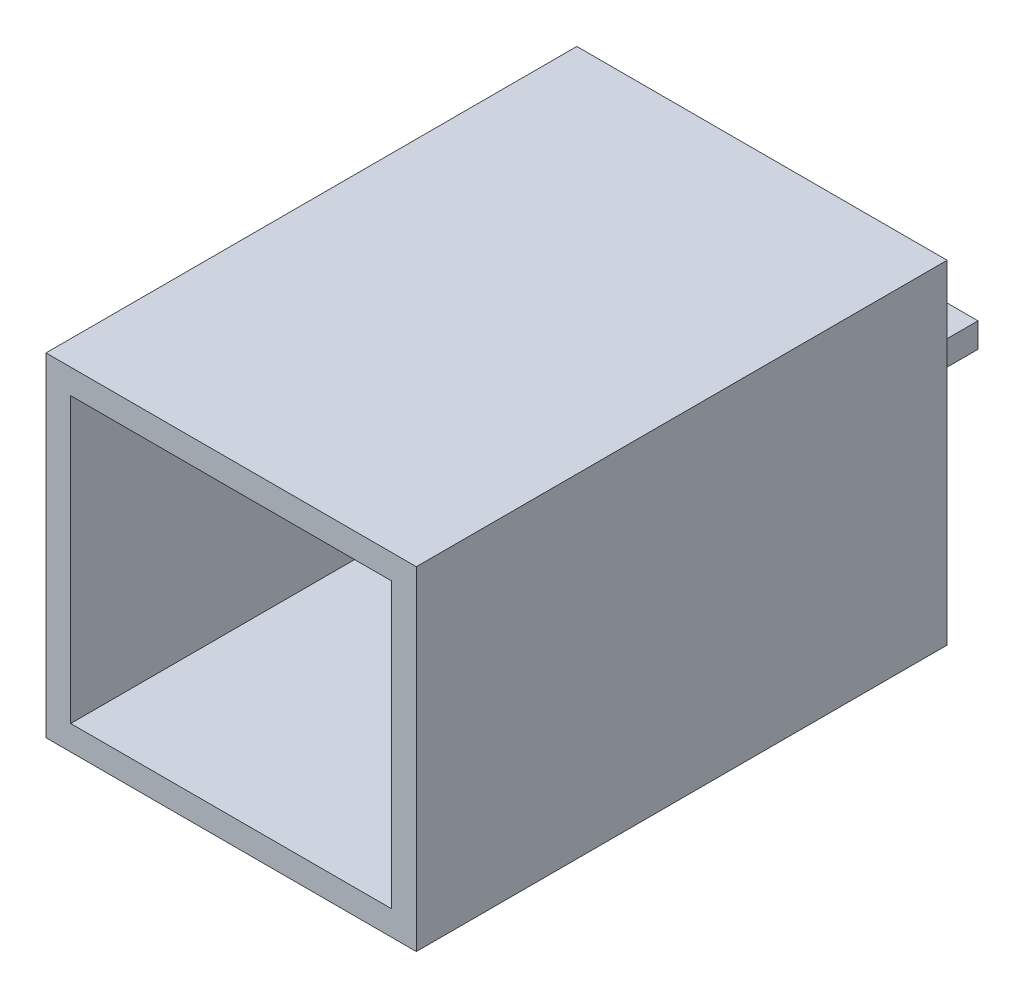
ISO-10303-21;
HEADER;
FILE_DESCRIPTION(('STEP AP214'),'2;1');
FILE_NAME('part.step','',(''),(''),'','','');
FILE_SCHEMA(('AUTOMOTIVE_DESIGN { 1 0 10303 214 1 1 1 1 }'));
ENDSEC;
DATA;
#1=APPLICATION_CONTEXT('core data for automotive mechanical design processes');
#2=APPLICATION_PROTOCOL_DEFINITION('international standard','automotive_design',2000,#1);
#3=PRODUCT_CONTEXT('',#1,'mechanical');
#4=PRODUCT('Part','Part','',(#3));
#5=PRODUCT_RELATED_PRODUCT_CATEGORY('part','',(#4));
#6=PRODUCT_DEFINITION_FORMATION('','',#4);
#7=PRODUCT_DEFINITION_CONTEXT('part definition',#1,'design');
#8=PRODUCT_DEFINITION('design','',#6,#7);
#9=PRODUCT_DEFINITION_SHAPE('','',#8);
#10=(LENGTH_UNIT() NAMED_UNIT(*) SI_UNIT(.MILLI.,.METRE.));
#11=(NAMED_UNIT(*) PLANE_ANGLE_UNIT() SI_UNIT($,.RADIAN.));
#12=(NAMED_UNIT(*) SI_UNIT($,.STERADIAN.) SOLID_ANGLE_UNIT());
#13=UNCERTAINTY_MEASURE_WITH_UNIT(LENGTH_MEASURE(1.E-05),#10,'distance_accuracy_value','');
#14=(GEOMETRIC_REPRESENTATION_CONTEXT(3) GLOBAL_UNCERTAINTY_ASSIGNED_CONTEXT((#13)) GLOBAL_UNIT_ASSIGNED_CONTEXT((#10,
#11,#12)) REPRESENTATION_CONTEXT('',''));
#15=CARTESIAN_POINT('',(0.,0.,0.));
#16=DIRECTION('',(0.,0.,1.));
#17=DIRECTION('',(1.,0.,0.));
#18=AXIS2_PLACEMENT_3D('',#15,#16,#17);
#19=CARTESIAN_POINT('',(-13.,-11.5,43.));
#20=DIRECTION('',(0.,1.,0.));
#21=DIRECTION('',(0.,0.,1.));
#22=AXIS2_PLACEMENT_3D('',#19,#20,#21);
#23=PLANE('',#22);
#24=DIRECTION('',(0.,0.,1.));
#25=VECTOR('',#24,1.);
#26=CARTESIAN_POINT('',(2.5,-11.5,-10.));
#27=LINE('',#26,#25);
#28=CARTESIAN_POINT('',(2.5,-11.5,-4.5));
#29=VERTEX_POINT('',#28);
#30=CARTESIAN_POINT('',(2.5,-11.5,0.));
#31=VERTEX_POINT('',#30);
#32=EDGE_CURVE('E225',#29,#31,#27,.T.);
#33=ORIENTED_EDGE('',*,*,#32,.F.);
#34=DIRECTION('',(1.,0.,0.));
#35=VECTOR('',#34,1.);
#36=CARTESIAN_POINT('',(-13.,-11.5,-4.5));
#37=LINE('',#36,#35);
#38=CARTESIAN_POINT('',(-2.5,-11.5,-4.5));
#39=VERTEX_POINT('',#38);
#40=EDGE_CURVE('E367',#29,#39,#37,.F.);
#41=ORIENTED_EDGE('',*,*,#40,.T.);
#42=DIRECTION('',(0.,0.,1.));
#43=VECTOR('',#42,1.);
#44=CARTESIAN_POINT('',(-2.5,-11.5,-10.));
#45=LINE('',#44,#43);
#46=CARTESIAN_POINT('',(-2.5,-11.5,0.));
#47=VERTEX_POINT('',#46);
#48=EDGE_CURVE('E231',#39,#47,#45,.T.);
#49=ORIENTED_EDGE('',*,*,#48,.T.);
#50=DIRECTION('',(1.,0.,0.));
#51=VECTOR('',#50,1.);
#52=CARTESIAN_POINT('',(-13.,-11.5,0.));
#53=LINE('',#52,#51);
#54=CARTESIAN_POINT('',(-13.,-11.5,0.));
#55=VERTEX_POINT('',#54);
#56=EDGE_CURVE('E264',#55,#47,#53,.T.);
#57=ORIENTED_EDGE('',*,*,#56,.F.);
#58=DIRECTION('',(0.,0.,-1.));
#59=VECTOR('',#58,1.);
#60=CARTESIAN_POINT('',(-13.,-11.5,43.));
#61=LINE('',#60,#59);
#62=CARTESIAN_POINT('',(-13.,-11.5,43.));
#63=VERTEX_POINT('',#62);
#64=EDGE_CURVE('E288',#63,#55,#61,.T.);
#65=ORIENTED_EDGE('',*,*,#64,.F.);
#66=DIRECTION('',(1.,0.,0.));
#67=VECTOR('',#66,1.);
#68=CARTESIAN_POINT('',(-13.,-11.5,43.));
#69=LINE('',#68,#67);
#70=CARTESIAN_POINT('',(13.,-11.5,43.));
#71=VERTEX_POINT('',#70);
#72=EDGE_CURVE('E271',#63,#71,#69,.T.);
#73=ORIENTED_EDGE('',*,*,#72,.T.);
#74=DIRECTION('',(0.,0.,-1.));
#75=VECTOR('',#74,1.);
#76=CARTESIAN_POINT('',(13.,-11.5,43.));
#77=LINE('',#76,#75);
#78=CARTESIAN_POINT('',(13.,-11.5,0.));
#79=VERTEX_POINT('',#78);
#80=EDGE_CURVE('E274',#71,#79,#77,.T.);
#81=ORIENTED_EDGE('',*,*,#80,.T.);
#82=EDGE_CURVE('E281',#31,#79,#53,.T.);
#83=ORIENTED_EDGE('',*,*,#82,.F.);
#84=EDGE_LOOP('',(#33,#41,#49,#57,#65,#73,#81,#83));
#85=FACE_BOUND('',#84,.T.);
#86=ADVANCED_FACE('F45',(#85),#23,.T.);
#87=CARTESIAN_POINT('',(-2.5,-11.5,-10.));
#88=DIRECTION('',(-1.,0.,0.));
#89=DIRECTION('',(0.,-1.,0.));
#90=AXIS2_PLACEMENT_3D('',#87,#88,#89);
#91=PLANE('',#90);
#92=ORIENTED_EDGE('',*,*,#48,.F.);
#93=CARTESIAN_POINT('',(-2.5,-12.,-4.5));
#94=DIRECTION('',(-1.,0.,0.));
#95=DIRECTION('',(0.,-1.,0.));
#96=AXIS2_PLACEMENT_3D('',#93,#94,#95);
#97=CIRCLE('',#96,0.5);
#98=CARTESIAN_POINT('',(-2.5,-12.,-5.));
#99=VERTEX_POINT('',#98);
#100=EDGE_CURVE('E375',#39,#99,#97,.T.);
#101=ORIENTED_EDGE('',*,*,#100,.T.);
#102=DIRECTION('',(0.,1.,0.));
#103=VECTOR('',#102,1.);
#104=CARTESIAN_POINT('',(-2.5,-11.5,-5.));
#105=LINE('',#104,#103);
#106=CARTESIAN_POINT('',(-2.5,-13.2928932188135,-5.));
#107=VERTEX_POINT('',#106);
#108=EDGE_CURVE('E400',#107,#99,#105,.T.);
#109=ORIENTED_EDGE('',*,*,#108,.F.);
#110=CARTESIAN_POINT('',(-2.5,-13.2928932188135,-4.5));
#111=DIRECTION('',(-1.,0.,0.));
#112=DIRECTION('',(0.,-1.,0.));
#113=AXIS2_PLACEMENT_3D('',#110,#111,#112);
#114=CIRCLE('',#113,0.5);
#115=CARTESIAN_POINT('',(-2.5,-13.6464466094067,-4.85355339059327));
#116=VERTEX_POINT('',#115);
#117=EDGE_CURVE('E372',#107,#116,#114,.T.);
#118=ORIENTED_EDGE('',*,*,#117,.T.);
#119=DIRECTION('',(0.,-0.707106781186548,0.707106781186548));
#120=VECTOR('',#119,1.);
#121=CARTESIAN_POINT('',(-2.5,-13.5,-5.));
#122=LINE('',#121,#120);
#123=CARTESIAN_POINT('',(-2.5,-14.6464466094067,-3.85355339059327));
#124=VERTEX_POINT('',#123);
#125=EDGE_CURVE('E387',#116,#124,#122,.T.);
#126=ORIENTED_EDGE('',*,*,#125,.T.);
#127=CARTESIAN_POINT('',(-2.5,-14.2928932188135,-3.5));
#128=DIRECTION('',(-1.,0.,0.));
#129=DIRECTION('',(0.,-1.,0.));
#130=AXIS2_PLACEMENT_3D('',#127,#128,#129);
#131=CIRCLE('',#130,0.5);
#132=CARTESIAN_POINT('',(-2.5,-14.2928932188135,-3.));
#133=VERTEX_POINT('',#132);
#134=EDGE_CURVE('E61',#124,#133,#131,.T.);
#135=ORIENTED_EDGE('',*,*,#134,.T.);
#136=DIRECTION('',(0.,1.,0.));
#137=VECTOR('',#136,1.);
#138=CARTESIAN_POINT('',(-2.5,-15.5,-3.));
#139=LINE('',#138,#137);
#140=CARTESIAN_POINT('',(-2.5,-13.5,-3.));
#141=VERTEX_POINT('',#140);
#142=EDGE_CURVE('E392',#133,#141,#139,.T.);
#143=ORIENTED_EDGE('',*,*,#142,.T.);
#144=DIRECTION('',(0.,0.,1.));
#145=VECTOR('',#144,1.);
#146=CARTESIAN_POINT('',(-2.5,-13.5,-10.));
#147=LINE('',#146,#145);
#148=CARTESIAN_POINT('',(-2.5,-13.5,0.));
#149=VERTEX_POINT('',#148);
#150=EDGE_CURVE('E216',#141,#149,#147,.T.);
#151=ORIENTED_EDGE('',*,*,#150,.T.);
#152=DIRECTION('',(0.,-1.,0.));
#153=VECTOR('',#152,1.);
#154=CARTESIAN_POINT('',(-2.5,-11.5,0.));
#155=LINE('',#154,#153);
#156=EDGE_CURVE('E229',#47,#149,#155,.T.);
#157=ORIENTED_EDGE('',*,*,#156,.F.);
#158=EDGE_LOOP('',(#92,#101,#109,#118,#126,#135,#143,#151,#157));
#159=FACE_BOUND('',#158,.T.);
#160=ADVANCED_FACE('F404',(#159),#91,.T.);
#161=CARTESIAN_POINT('',(2.5,-11.5,-10.));
#162=DIRECTION('',(-1.,0.,0.));
#163=DIRECTION('',(0.,-1.,0.));
#164=AXIS2_PLACEMENT_3D('',#161,#162,#163);
#165=PLANE('',#164);
#166=DIRECTION('',(0.,-1.,0.));
#167=VECTOR('',#166,1.);
#168=CARTESIAN_POINT('',(2.5,-11.5,-5.));
#169=LINE('',#168,#167);
#170=CARTESIAN_POINT('',(2.5,-12.,-5.));
#171=VERTEX_POINT('',#170);
#172=CARTESIAN_POINT('',(2.5,-13.2928932188135,-5.));
#173=VERTEX_POINT('',#172);
#174=EDGE_CURVE('E402',#171,#173,#169,.T.);
#175=ORIENTED_EDGE('',*,*,#174,.F.);
#176=CARTESIAN_POINT('',(2.5,-12.,-4.5));
#177=DIRECTION('',(-1.,0.,0.));
#178=DIRECTION('',(0.,-1.,0.));
#179=AXIS2_PLACEMENT_3D('',#176,#177,#178);
#180=CIRCLE('',#179,0.5);
#181=EDGE_CURVE('E364',#171,#29,#180,.F.);
#182=ORIENTED_EDGE('',*,*,#181,.T.);
#183=ORIENTED_EDGE('',*,*,#32,.T.);
#184=DIRECTION('',(0.,-1.,0.));
#185=VECTOR('',#184,1.);
#186=CARTESIAN_POINT('',(2.5,-11.5,0.));
#187=LINE('',#186,#185);
#188=CARTESIAN_POINT('',(2.5,-13.5,0.));
#189=VERTEX_POINT('',#188);
#190=EDGE_CURVE('E222',#31,#189,#187,.T.);
#191=ORIENTED_EDGE('',*,*,#190,.T.);
#192=DIRECTION('',(0.,0.,1.));
#193=VECTOR('',#192,1.);
#194=CARTESIAN_POINT('',(2.5,-13.5,-10.));
#195=LINE('',#194,#193);
#196=CARTESIAN_POINT('',(2.5,-13.5,-3.));
#197=VERTEX_POINT('',#196);
#198=EDGE_CURVE('E213',#197,#189,#195,.T.);
#199=ORIENTED_EDGE('',*,*,#198,.F.);
#200=DIRECTION('',(0.,1.,0.));
#201=VECTOR('',#200,1.);
#202=CARTESIAN_POINT('',(2.5,-15.5,-3.));
#203=LINE('',#202,#201);
#204=CARTESIAN_POINT('',(2.5,-14.2928932188135,-3.));
#205=VERTEX_POINT('',#204);
#206=EDGE_CURVE('E200',#205,#197,#203,.T.);
#207=ORIENTED_EDGE('',*,*,#206,.F.);
#208=CARTESIAN_POINT('',(2.5,-14.2928932188135,-3.5));
#209=DIRECTION('',(-1.,0.,0.));
#210=DIRECTION('',(0.,-1.,0.));
#211=AXIS2_PLACEMENT_3D('',#208,#209,#210);
#212=CIRCLE('',#211,0.5);
#213=CARTESIAN_POINT('',(2.5,-14.6464466094067,-3.85355339059327));
#214=VERTEX_POINT('',#213);
#215=EDGE_CURVE('E358',#205,#214,#212,.F.);
#216=ORIENTED_EDGE('',*,*,#215,.T.);
#217=DIRECTION('',(0.,-0.707106781186548,0.707106781186548));
#218=VECTOR('',#217,1.);
#219=CARTESIAN_POINT('',(2.5,-13.5,-5.));
#220=LINE('',#219,#218);
#221=CARTESIAN_POINT('',(2.5,-13.6464466094067,-4.85355339059327));
#222=VERTEX_POINT('',#221);
#223=EDGE_CURVE('E209',#222,#214,#220,.T.);
#224=ORIENTED_EDGE('',*,*,#223,.F.);
#225=CARTESIAN_POINT('',(2.5,-13.2928932188135,-4.5));
#226=DIRECTION('',(-1.,0.,0.));
#227=DIRECTION('',(0.,-1.,0.));
#228=AXIS2_PLACEMENT_3D('',#225,#226,#227);
#229=CIRCLE('',#228,0.5);
#230=EDGE_CURVE('E361',#222,#173,#229,.F.);
#231=ORIENTED_EDGE('',*,*,#230,.T.);
#232=EDGE_LOOP('',(#175,#182,#183,#191,#199,#207,#216,#224,#231));
#233=FACE_BOUND('',#232,.T.);
#234=ADVANCED_FACE('F220',(#233),#165,.F.);
#235=CARTESIAN_POINT('',(-15.,-13.5,43.));
#236=DIRECTION('',(0.,1.,0.));
#237=DIRECTION('',(0.,0.,1.));
#238=AXIS2_PLACEMENT_3D('',#235,#236,#237);
#239=PLANE('',#238);
#240=DIRECTION('',(-1.,0.,0.));
#241=VECTOR('',#240,1.);
#242=CARTESIAN_POINT('',(2.5,-13.5,-3.));
#243=LINE('',#242,#241);
#244=EDGE_CURVE('E203',#197,#141,#243,.T.);
#245=ORIENTED_EDGE('',*,*,#244,.F.);
#246=ORIENTED_EDGE('',*,*,#198,.T.);
#247=DIRECTION('',(1.,0.,0.));
#248=VECTOR('',#247,1.);
#249=CARTESIAN_POINT('',(-15.,-13.5,0.));
#250=LINE('',#249,#248);
#251=CARTESIAN_POINT('',(15.,-13.5,0.));
#252=VERTEX_POINT('',#251);
#253=EDGE_CURVE('E325',#189,#252,#250,.T.);
#254=ORIENTED_EDGE('',*,*,#253,.T.);
#255=DIRECTION('',(0.,0.,-1.));
#256=VECTOR('',#255,1.);
#257=CARTESIAN_POINT('',(15.,-13.5,43.));
#258=LINE('',#257,#256);
#259=CARTESIAN_POINT('',(15.,-13.5,43.));
#260=VERTEX_POINT('',#259);
#261=EDGE_CURVE('E315',#260,#252,#258,.T.);
#262=ORIENTED_EDGE('',*,*,#261,.F.);
#263=DIRECTION('',(1.,0.,0.));
#264=VECTOR('',#263,1.);
#265=CARTESIAN_POINT('',(-15.,-13.5,43.));
#266=LINE('',#265,#264);
#267=CARTESIAN_POINT('',(-15.,-13.5,43.));
#268=VERTEX_POINT('',#267);
#269=EDGE_CURVE('E312',#268,#260,#266,.T.);
#270=ORIENTED_EDGE('',*,*,#269,.F.);
#271=DIRECTION('',(0.,0.,-1.));
#272=VECTOR('',#271,1.);
#273=CARTESIAN_POINT('',(-15.,-13.5,43.));
#274=LINE('',#273,#272);
#275=CARTESIAN_POINT('',(-15.,-13.5,0.));
#276=VERTEX_POINT('',#275);
#277=EDGE_CURVE('E331',#268,#276,#274,.T.);
#278=ORIENTED_EDGE('',*,*,#277,.T.);
#279=EDGE_CURVE('E306',#276,#149,#250,.T.);
#280=ORIENTED_EDGE('',*,*,#279,.T.);
#281=ORIENTED_EDGE('',*,*,#150,.F.);
#282=EDGE_LOOP('',(#245,#246,#254,#262,#270,#278,#280,#281));
#283=FACE_BOUND('',#282,.T.);
#284=ADVANCED_FACE('F212',(#283),#239,.F.);
#285=CARTESIAN_POINT('',(0.,0.,0.));
#286=DIRECTION('',(0.,0.,1.));
#287=DIRECTION('',(1.,0.,0.));
#288=AXIS2_PLACEMENT_3D('',#285,#286,#287);
#289=PLANE('',#288);
#290=DIRECTION('',(0.,1.,0.));
#291=VECTOR('',#290,1.);
#292=CARTESIAN_POINT('',(-7.5,-1.5,0.));
#293=LINE('',#292,#291);
#294=CARTESIAN_POINT('',(-7.5,-1.5,0.));
#295=VERTEX_POINT('',#294);
#296=CARTESIAN_POINT('',(-7.5,0.500000000000001,0.));
#297=VERTEX_POINT('',#296);
#298=EDGE_CURVE('E434',#295,#297,#293,.T.);
#299=ORIENTED_EDGE('',*,*,#298,.F.);
#300=DIRECTION('',(-1.,0.,0.));
#301=VECTOR('',#300,1.);
#302=CARTESIAN_POINT('',(15.,-1.5,0.));
#303=LINE('',#302,#301);
#304=CARTESIAN_POINT('',(-13.,-1.5,0.));
#305=VERTEX_POINT('',#304);
#306=EDGE_CURVE('E248',#295,#305,#303,.T.);
#307=ORIENTED_EDGE('',*,*,#306,.T.);
#308=DIRECTION('',(0.,-1.,0.));
#309=VECTOR('',#308,1.);
#310=CARTESIAN_POINT('',(-13.,11.5,0.));
#311=LINE('',#310,#309);
#312=EDGE_CURVE('E278',#305,#55,#311,.T.);
#313=ORIENTED_EDGE('',*,*,#312,.T.);
#314=ORIENTED_EDGE('',*,*,#56,.T.);
#315=ORIENTED_EDGE('',*,*,#156,.T.);
#316=ORIENTED_EDGE('',*,*,#279,.F.);
#317=DIRECTION('',(0.,-1.,0.));
#318=VECTOR('',#317,1.);
#319=CARTESIAN_POINT('',(-15.,13.5,0.));
#320=LINE('',#319,#318);
#321=CARTESIAN_POINT('',(-15.,13.5,0.));
#322=VERTEX_POINT('',#321);
#323=EDGE_CURVE('E322',#322,#276,#320,.T.);
#324=ORIENTED_EDGE('',*,*,#323,.F.);
#325=DIRECTION('',(-1.,0.,0.));
#326=VECTOR('',#325,1.);
#327=CARTESIAN_POINT('',(-15.,13.5,0.));
#328=LINE('',#327,#326);
#329=CARTESIAN_POINT('',(15.,13.5,0.));
#330=VERTEX_POINT('',#329);
#331=EDGE_CURVE('E318',#330,#322,#328,.T.);
#332=ORIENTED_EDGE('',*,*,#331,.F.);
#333=DIRECTION('',(0.,1.,0.));
#334=VECTOR('',#333,1.);
#335=CARTESIAN_POINT('',(15.,13.5,0.));
#336=LINE('',#335,#334);
#337=EDGE_CURVE('E300',#252,#330,#336,.T.);
#338=ORIENTED_EDGE('',*,*,#337,.F.);
#339=ORIENTED_EDGE('',*,*,#253,.F.);
#340=ORIENTED_EDGE('',*,*,#190,.F.);
#341=ORIENTED_EDGE('',*,*,#82,.T.);
#342=DIRECTION('',(0.,1.,0.));
#343=VECTOR('',#342,1.);
#344=CARTESIAN_POINT('',(13.,11.5,0.));
#345=LINE('',#344,#343);
#346=CARTESIAN_POINT('',(13.,-1.5,0.));
#347=VERTEX_POINT('',#346);
#348=EDGE_CURVE('E259',#79,#347,#345,.T.);
#349=ORIENTED_EDGE('',*,*,#348,.T.);
#350=CARTESIAN_POINT('',(7.5,-1.5,0.));
#351=VERTEX_POINT('',#350);
#352=EDGE_CURVE('E244',#347,#351,#303,.T.);
#353=ORIENTED_EDGE('',*,*,#352,.T.);
#354=DIRECTION('',(0.,1.,0.));
#355=VECTOR('',#354,1.);
#356=CARTESIAN_POINT('',(7.5,-1.5,0.));
#357=LINE('',#356,#355);
#358=CARTESIAN_POINT('',(7.5,0.5,0.));
#359=VERTEX_POINT('',#358);
#360=EDGE_CURVE('E420',#351,#359,#357,.T.);
#361=ORIENTED_EDGE('',*,*,#360,.T.);
#362=DIRECTION('',(-1.,0.,0.));
#363=VECTOR('',#362,1.);
#364=CARTESIAN_POINT('',(7.5,0.5,0.));
#365=LINE('',#364,#363);
#366=EDGE_CURVE('E238',#359,#297,#365,.T.);
#367=ORIENTED_EDGE('',*,*,#366,.T.);
#368=EDGE_LOOP('',(#299,#307,#313,#314,#315,#316,#324,#332,#338,#339,#340,#341,#349,#353,#361,#367));
#369=FACE_BOUND('',#368,.T.);
#370=ADVANCED_FACE('F463',(#369),#289,.F.);
#371=CARTESIAN_POINT('',(-13.,11.5,43.));
#372=DIRECTION('',(0.,-1.,0.));
#373=DIRECTION('',(0.,0.,-1.));
#374=AXIS2_PLACEMENT_3D('',#371,#372,#373);
#375=PLANE('',#374);
#376=DIRECTION('',(0.,0.,-1.));
#377=VECTOR('',#376,1.);
#378=CARTESIAN_POINT('',(-13.,11.5,43.));
#379=LINE('',#378,#377);
#380=CARTESIAN_POINT('',(-13.,11.5,43.));
#381=VERTEX_POINT('',#380);
#382=CARTESIAN_POINT('',(-13.,11.5,2.));
#383=VERTEX_POINT('',#382);
#384=EDGE_CURVE('E292',#381,#383,#379,.T.);
#385=ORIENTED_EDGE('',*,*,#384,.T.);
#386=DIRECTION('',(1.,0.,0.));
#387=VECTOR('',#386,1.);
#388=CARTESIAN_POINT('',(-13.,11.5,2.));
#389=LINE('',#388,#387);
#390=CARTESIAN_POINT('',(13.,11.5,2.));
#391=VERTEX_POINT('',#390);
#392=EDGE_CURVE('E243',#383,#391,#389,.T.);
#393=ORIENTED_EDGE('',*,*,#392,.T.);
#394=DIRECTION('',(0.,0.,-1.));
#395=VECTOR('',#394,1.);
#396=CARTESIAN_POINT('',(13.,11.5,43.));
#397=LINE('',#396,#395);
#398=CARTESIAN_POINT('',(13.,11.5,43.));
#399=VERTEX_POINT('',#398);
#400=EDGE_CURVE('E296',#399,#391,#397,.T.);
#401=ORIENTED_EDGE('',*,*,#400,.F.);
#402=DIRECTION('',(-1.,0.,0.));
#403=VECTOR('',#402,1.);
#404=CARTESIAN_POINT('',(-13.,11.5,43.));
#405=LINE('',#404,#403);
#406=EDGE_CURVE('E263',#399,#381,#405,.T.);
#407=ORIENTED_EDGE('',*,*,#406,.T.);
#408=EDGE_LOOP('',(#385,#393,#401,#407));
#409=FACE_BOUND('',#408,.T.);
#410=ADVANCED_FACE('F484',(#409),#375,.T.);
#411=CARTESIAN_POINT('',(0.,0.,43.));
#412=DIRECTION('',(0.,0.,1.));
#413=DIRECTION('',(1.,0.,0.));
#414=AXIS2_PLACEMENT_3D('',#411,#412,#413);
#415=PLANE('',#414);
#416=DIRECTION('',(0.,1.,0.));
#417=VECTOR('',#416,1.);
#418=CARTESIAN_POINT('',(15.,13.5,43.));
#419=LINE('',#418,#417);
#420=CARTESIAN_POINT('',(15.,13.5,43.));
#421=VERTEX_POINT('',#420);
#422=EDGE_CURVE('E301',#260,#421,#419,.T.);
#423=ORIENTED_EDGE('',*,*,#422,.T.);
#424=DIRECTION('',(-1.,0.,0.));
#425=VECTOR('',#424,1.);
#426=CARTESIAN_POINT('',(-15.,13.5,43.));
#427=LINE('',#426,#425);
#428=CARTESIAN_POINT('',(-15.,13.5,43.));
#429=VERTEX_POINT('',#428);
#430=EDGE_CURVE('E305',#421,#429,#427,.T.);
#431=ORIENTED_EDGE('',*,*,#430,.T.);
#432=DIRECTION('',(0.,-1.,0.));
#433=VECTOR('',#432,1.);
#434=CARTESIAN_POINT('',(-15.,13.5,43.));
#435=LINE('',#434,#433);
#436=EDGE_CURVE('E309',#429,#268,#435,.T.);
#437=ORIENTED_EDGE('',*,*,#436,.T.);
#438=ORIENTED_EDGE('',*,*,#269,.T.);
#439=EDGE_LOOP('',(#423,#431,#437,#438));
#440=FACE_BOUND('',#439,.T.);
#441=ORIENTED_EDGE('',*,*,#406,.F.);
#442=DIRECTION('',(0.,1.,0.));
#443=VECTOR('',#442,1.);
#444=CARTESIAN_POINT('',(13.,11.5,43.));
#445=LINE('',#444,#443);
#446=EDGE_CURVE('E260',#71,#399,#445,.T.);
#447=ORIENTED_EDGE('',*,*,#446,.F.);
#448=ORIENTED_EDGE('',*,*,#72,.F.);
#449=DIRECTION('',(0.,-1.,0.));
#450=VECTOR('',#449,1.);
#451=CARTESIAN_POINT('',(-13.,11.5,43.));
#452=LINE('',#451,#450);
#453=EDGE_CURVE('E267',#381,#63,#452,.T.);
#454=ORIENTED_EDGE('',*,*,#453,.F.);
#455=EDGE_LOOP('',(#441,#447,#448,#454));
#456=FACE_BOUND('',#455,.T.);
#457=ADVANCED_FACE('F482',(#440,#456),#415,.T.);
#458=CARTESIAN_POINT('',(15.,13.5,43.));
#459=DIRECTION('',(-1.,0.,0.));
#460=DIRECTION('',(0.,0.,1.));
#461=AXIS2_PLACEMENT_3D('',#458,#459,#460);
#462=PLANE('',#461);
#463=ORIENTED_EDGE('',*,*,#337,.T.);
#464=DIRECTION('',(0.,0.,-1.));
#465=VECTOR('',#464,1.);
#466=CARTESIAN_POINT('',(15.,13.5,43.));
#467=LINE('',#466,#465);
#468=EDGE_CURVE('E338',#421,#330,#467,.T.);
#469=ORIENTED_EDGE('',*,*,#468,.F.);
#470=ORIENTED_EDGE('',*,*,#422,.F.);
#471=ORIENTED_EDGE('',*,*,#261,.T.);
#472=EDGE_LOOP('',(#463,#469,#470,#471));
#473=FACE_BOUND('',#472,.T.);
#474=ADVANCED_FACE('F498',(#473),#462,.F.);
#475=CARTESIAN_POINT('',(-15.,13.5,43.));
#476=DIRECTION('',(0.,-1.,0.));
#477=DIRECTION('',(0.,0.,-1.));
#478=AXIS2_PLACEMENT_3D('',#475,#476,#477);
#479=PLANE('',#478);
#480=ORIENTED_EDGE('',*,*,#331,.T.);
#481=DIRECTION('',(0.,0.,-1.));
#482=VECTOR('',#481,1.);
#483=CARTESIAN_POINT('',(-15.,13.5,43.));
#484=LINE('',#483,#482);
#485=EDGE_CURVE('E335',#429,#322,#484,.T.);
#486=ORIENTED_EDGE('',*,*,#485,.F.);
#487=ORIENTED_EDGE('',*,*,#430,.F.);
#488=ORIENTED_EDGE('',*,*,#468,.T.);
#489=EDGE_LOOP('',(#480,#486,#487,#488));
#490=FACE_BOUND('',#489,.T.);
#491=ADVANCED_FACE('F504',(#490),#479,.F.);
#492=CARTESIAN_POINT('',(-15.,13.5,43.));
#493=DIRECTION('',(1.,0.,0.));
#494=DIRECTION('',(0.,0.,-1.));
#495=AXIS2_PLACEMENT_3D('',#492,#493,#494);
#496=PLANE('',#495);
#497=ORIENTED_EDGE('',*,*,#323,.T.);
#498=ORIENTED_EDGE('',*,*,#277,.F.);
#499=ORIENTED_EDGE('',*,*,#436,.F.);
#500=ORIENTED_EDGE('',*,*,#485,.T.);
#501=EDGE_LOOP('',(#497,#498,#499,#500));
#502=FACE_BOUND('',#501,.T.);
#503=ADVANCED_FACE('F509',(#502),#496,.F.);
#504=CARTESIAN_POINT('',(13.,11.5,43.));
#505=DIRECTION('',(-1.,0.,0.));
#506=DIRECTION('',(0.,0.,1.));
#507=AXIS2_PLACEMENT_3D('',#504,#505,#506);
#508=PLANE('',#507);
#509=DIRECTION('',(0.,0.,1.));
#510=VECTOR('',#509,1.);
#511=CARTESIAN_POINT('',(13.,-1.5,43.));
#512=LINE('',#511,#510);
#513=CARTESIAN_POINT('',(13.,-1.5,2.));
#514=VERTEX_POINT('',#513);
#515=EDGE_CURVE('E256',#347,#514,#512,.T.);
#516=ORIENTED_EDGE('',*,*,#515,.F.);
#517=ORIENTED_EDGE('',*,*,#348,.F.);
#518=ORIENTED_EDGE('',*,*,#80,.F.);
#519=ORIENTED_EDGE('',*,*,#446,.T.);
#520=ORIENTED_EDGE('',*,*,#400,.T.);
#521=DIRECTION('',(0.,-1.,0.));
#522=VECTOR('',#521,1.);
#523=CARTESIAN_POINT('',(13.,11.5,2.));
#524=LINE('',#523,#522);
#525=EDGE_CURVE('E252',#391,#514,#524,.T.);
#526=ORIENTED_EDGE('',*,*,#525,.T.);
#527=EDGE_LOOP('',(#516,#517,#518,#519,#520,#526));
#528=FACE_BOUND('',#527,.T.);
#529=ADVANCED_FACE('F479',(#528),#508,.T.);
#530=CARTESIAN_POINT('',(-13.,11.5,43.));
#531=DIRECTION('',(1.,0.,0.));
#532=DIRECTION('',(0.,0.,-1.));
#533=AXIS2_PLACEMENT_3D('',#530,#531,#532);
#534=PLANE('',#533);
#535=DIRECTION('',(0.,0.,-1.));
#536=VECTOR('',#535,1.);
#537=CARTESIAN_POINT('',(-13.,-1.5,43.));
#538=LINE('',#537,#536);
#539=CARTESIAN_POINT('',(-13.,-1.5,2.));
#540=VERTEX_POINT('',#539);
#541=EDGE_CURVE('E346',#540,#305,#538,.T.);
#542=ORIENTED_EDGE('',*,*,#541,.F.);
#543=DIRECTION('',(0.,1.,0.));
#544=VECTOR('',#543,1.);
#545=CARTESIAN_POINT('',(-13.,11.5,2.));
#546=LINE('',#545,#544);
#547=EDGE_CURVE('E342',#540,#383,#546,.T.);
#548=ORIENTED_EDGE('',*,*,#547,.T.);
#549=ORIENTED_EDGE('',*,*,#384,.F.);
#550=ORIENTED_EDGE('',*,*,#453,.T.);
#551=ORIENTED_EDGE('',*,*,#64,.T.);
#552=ORIENTED_EDGE('',*,*,#312,.F.);
#553=EDGE_LOOP('',(#542,#548,#549,#550,#551,#552));
#554=FACE_BOUND('',#553,.T.);
#555=ADVANCED_FACE('F468',(#554),#534,.T.);
#556=CARTESIAN_POINT('',(15.,-1.5,2.));
#557=DIRECTION('',(0.,-1.,0.));
#558=DIRECTION('',(0.,0.,-1.));
#559=AXIS2_PLACEMENT_3D('',#556,#557,#558);
#560=PLANE('',#559);
#561=ORIENTED_EDGE('',*,*,#352,.F.);
#562=ORIENTED_EDGE('',*,*,#515,.T.);
#563=DIRECTION('',(-1.,0.,0.));
#564=VECTOR('',#563,1.);
#565=CARTESIAN_POINT('',(15.,-1.5,2.));
#566=LINE('',#565,#564);
#567=EDGE_CURVE('E239',#514,#540,#566,.T.);
#568=ORIENTED_EDGE('',*,*,#567,.T.);
#569=ORIENTED_EDGE('',*,*,#541,.T.);
#570=ORIENTED_EDGE('',*,*,#306,.F.);
#571=DIRECTION('',(0.,0.,1.));
#572=VECTOR('',#571,1.);
#573=CARTESIAN_POINT('',(-7.5,-1.5,-10.));
#574=LINE('',#573,#572);
#575=CARTESIAN_POINT('',(-7.5,-1.5,-10.));
#576=VERTEX_POINT('',#575);
#577=EDGE_CURVE('E448',#576,#295,#574,.T.);
#578=ORIENTED_EDGE('',*,*,#577,.F.);
#579=DIRECTION('',(-1.,0.,0.));
#580=VECTOR('',#579,1.);
#581=CARTESIAN_POINT('',(7.5,-1.5,-10.));
#582=LINE('',#581,#580);
#583=CARTESIAN_POINT('',(7.5,-1.5,-10.));
#584=VERTEX_POINT('',#583);
#585=EDGE_CURVE('E423',#584,#576,#582,.T.);
#586=ORIENTED_EDGE('',*,*,#585,.F.);
#587=DIRECTION('',(0.,0.,1.));
#588=VECTOR('',#587,1.);
#589=CARTESIAN_POINT('',(7.5,-1.5,-10.));
#590=LINE('',#589,#588);
#591=EDGE_CURVE('E445',#584,#351,#590,.T.);
#592=ORIENTED_EDGE('',*,*,#591,.T.);
#593=EDGE_LOOP('',(#561,#562,#568,#569,#570,#578,#586,#592));
#594=FACE_BOUND('',#593,.T.);
#595=ADVANCED_FACE('F489',(#594),#560,.T.);
#596=CARTESIAN_POINT('',(0.,0.,2.));
#597=DIRECTION('',(0.,0.,-1.));
#598=DIRECTION('',(-1.,0.,0.));
#599=AXIS2_PLACEMENT_3D('',#596,#597,#598);
#600=PLANE('',#599);
#601=ORIENTED_EDGE('',*,*,#525,.F.);
#602=ORIENTED_EDGE('',*,*,#392,.F.);
#603=ORIENTED_EDGE('',*,*,#547,.F.);
#604=ORIENTED_EDGE('',*,*,#567,.F.);
#605=EDGE_LOOP('',(#601,#602,#603,#604));
#606=FACE_BOUND('',#605,.T.);
#607=ADVANCED_FACE('F487',(#606),#600,.F.);
#608=CARTESIAN_POINT('',(7.5,0.5,-10.));
#609=DIRECTION('',(0.,1.,0.));
#610=DIRECTION('',(-1.,0.,0.));
#611=AXIS2_PLACEMENT_3D('',#608,#609,#610);
#612=PLANE('',#611);
#613=ORIENTED_EDGE('',*,*,#366,.F.);
#614=DIRECTION('',(0.,0.,1.));
#615=VECTOR('',#614,1.);
#616=CARTESIAN_POINT('',(7.5,0.5,-10.));
#617=LINE('',#616,#615);
#618=CARTESIAN_POINT('',(7.5,0.5,-10.));
#619=VERTEX_POINT('',#618);
#620=EDGE_CURVE('E441',#619,#359,#617,.T.);
#621=ORIENTED_EDGE('',*,*,#620,.F.);
#622=DIRECTION('',(-1.,0.,0.));
#623=VECTOR('',#622,1.);
#624=CARTESIAN_POINT('',(7.5,0.5,-10.));
#625=LINE('',#624,#623);
#626=CARTESIAN_POINT('',(-7.5,0.500000000000001,-10.));
#627=VERTEX_POINT('',#626);
#628=EDGE_CURVE('E415',#619,#627,#625,.T.);
#629=ORIENTED_EDGE('',*,*,#628,.T.);
#630=DIRECTION('',(0.,0.,1.));
#631=VECTOR('',#630,1.);
#632=CARTESIAN_POINT('',(-7.5,0.500000000000001,-10.));
#633=LINE('',#632,#631);
#634=EDGE_CURVE('E430',#627,#297,#633,.T.);
#635=ORIENTED_EDGE('',*,*,#634,.T.);
#636=EDGE_LOOP('',(#613,#621,#629,#635));
#637=FACE_BOUND('',#636,.T.);
#638=ADVANCED_FACE('F546',(#637),#612,.T.);
#639=CARTESIAN_POINT('',(7.5,-1.5,-10.));
#640=DIRECTION('',(1.,0.,0.));
#641=DIRECTION('',(0.,0.,-1.));
#642=AXIS2_PLACEMENT_3D('',#639,#640,#641);
#643=PLANE('',#642);
#644=ORIENTED_EDGE('',*,*,#360,.F.);
#645=ORIENTED_EDGE('',*,*,#591,.F.);
#646=DIRECTION('',(0.,1.,0.));
#647=VECTOR('',#646,1.);
#648=CARTESIAN_POINT('',(7.5,-1.5,-10.));
#649=LINE('',#648,#647);
#650=EDGE_CURVE('E426',#584,#619,#649,.T.);
#651=ORIENTED_EDGE('',*,*,#650,.T.);
#652=ORIENTED_EDGE('',*,*,#620,.T.);
#653=EDGE_LOOP('',(#644,#645,#651,#652));
#654=FACE_BOUND('',#653,.T.);
#655=ADVANCED_FACE('F550',(#654),#643,.T.);
#656=CARTESIAN_POINT('',(-7.5,-1.5,-10.));
#657=DIRECTION('',(1.,0.,0.));
#658=DIRECTION('',(0.,0.,-1.));
#659=AXIS2_PLACEMENT_3D('',#656,#657,#658);
#660=PLANE('',#659);
#661=ORIENTED_EDGE('',*,*,#298,.T.);
#662=ORIENTED_EDGE('',*,*,#634,.F.);
#663=DIRECTION('',(0.,1.,0.));
#664=VECTOR('',#663,1.);
#665=CARTESIAN_POINT('',(-7.5,-1.5,-10.));
#666=LINE('',#665,#664);
#667=EDGE_CURVE('E419',#576,#627,#666,.T.);
#668=ORIENTED_EDGE('',*,*,#667,.F.);
#669=ORIENTED_EDGE('',*,*,#577,.T.);
#670=EDGE_LOOP('',(#661,#662,#668,#669));
#671=FACE_BOUND('',#670,.T.);
#672=ADVANCED_FACE('F569',(#671),#660,.F.);
#673=CARTESIAN_POINT('',(0.,0.,-10.));
#674=DIRECTION('',(0.,0.,-1.));
#675=DIRECTION('',(-1.,0.,0.));
#676=AXIS2_PLACEMENT_3D('',#673,#674,#675);
#677=PLANE('',#676);
#678=ORIENTED_EDGE('',*,*,#628,.F.);
#679=ORIENTED_EDGE('',*,*,#650,.F.);
#680=ORIENTED_EDGE('',*,*,#585,.T.);
#681=ORIENTED_EDGE('',*,*,#667,.T.);
#682=EDGE_LOOP('',(#678,#679,#680,#681));
#683=FACE_BOUND('',#682,.T.);
#684=ADVANCED_FACE('F577',(#683),#677,.T.);
#685=CARTESIAN_POINT('',(2.5,-15.5,-3.));
#686=DIRECTION('',(0.,0.,1.));
#687=DIRECTION('',(1.,0.,0.));
#688=AXIS2_PLACEMENT_3D('',#685,#686,#687);
#689=PLANE('',#688);
#690=ORIENTED_EDGE('',*,*,#142,.F.);
#691=DIRECTION('',(-1.,0.,0.));
#692=VECTOR('',#691,1.);
#693=CARTESIAN_POINT('',(2.5,-14.2928932188135,-3.));
#694=LINE('',#693,#692);
#695=EDGE_CURVE('E11',#133,#205,#694,.F.);
#696=ORIENTED_EDGE('',*,*,#695,.T.);
#697=ORIENTED_EDGE('',*,*,#206,.T.);
#698=ORIENTED_EDGE('',*,*,#244,.T.);
#699=EDGE_LOOP('',(#690,#696,#697,#698));
#700=FACE_BOUND('',#699,.T.);
#701=ADVANCED_FACE('F202',(#700),#689,.T.);
#702=CARTESIAN_POINT('',(2.5,-13.5,-5.));
#703=DIRECTION('',(0.,-0.707106781186548,-0.707106781186548));
#704=DIRECTION('',(0.,0.707106781186548,-0.707106781186548));
#705=AXIS2_PLACEMENT_3D('',#702,#703,#704);
#706=PLANE('',#705);
#707=ORIENTED_EDGE('',*,*,#125,.F.);
#708=DIRECTION('',(-1.,0.,0.));
#709=VECTOR('',#708,1.);
#710=CARTESIAN_POINT('',(2.5,-13.6464466094067,-4.85355339059327));
#711=LINE('',#710,#709);
#712=EDGE_CURVE('E54',#116,#222,#711,.F.);
#713=ORIENTED_EDGE('',*,*,#712,.T.);
#714=ORIENTED_EDGE('',*,*,#223,.T.);
#715=DIRECTION('',(-1.,0.,0.));
#716=VECTOR('',#715,1.);
#717=CARTESIAN_POINT('',(2.5,-14.6464466094067,-3.85355339059327));
#718=LINE('',#717,#716);
#719=EDGE_CURVE('E378',#214,#124,#718,.T.);
#720=ORIENTED_EDGE('',*,*,#719,.T.);
#721=EDGE_LOOP('',(#707,#713,#714,#720));
#722=FACE_BOUND('',#721,.T.);
#723=ADVANCED_FACE('F386',(#722),#706,.T.);
#724=CARTESIAN_POINT('',(0.,0.,-5.));
#725=DIRECTION('',(0.,0.,-1.));
#726=DIRECTION('',(-1.,0.,0.));
#727=AXIS2_PLACEMENT_3D('',#724,#725,#726);
#728=PLANE('',#727);
#729=ORIENTED_EDGE('',*,*,#108,.T.);
#730=DIRECTION('',(1.,0.,0.));
#731=VECTOR('',#730,1.);
#732=CARTESIAN_POINT('',(0.,-12.,-5.));
#733=LINE('',#732,#731);
#734=EDGE_CURVE('E354',#99,#171,#733,.T.);
#735=ORIENTED_EDGE('',*,*,#734,.T.);
#736=ORIENTED_EDGE('',*,*,#174,.T.);
#737=DIRECTION('',(-1.,0.,0.));
#738=VECTOR('',#737,1.);
#739=CARTESIAN_POINT('',(0.,-13.2928932188135,-5.));
#740=LINE('',#739,#738);
#741=EDGE_CURVE('E350',#173,#107,#740,.T.);
#742=ORIENTED_EDGE('',*,*,#741,.T.);
#743=EDGE_LOOP('',(#729,#735,#736,#742));
#744=FACE_BOUND('',#743,.T.);
#745=ADVANCED_FACE('F399',(#744),#728,.T.);
#746=CARTESIAN_POINT('',(0.,-12.,-4.5));
#747=DIRECTION('',(1.,0.,0.));
#748=DIRECTION('',(0.,0.,-1.));
#749=AXIS2_PLACEMENT_3D('',#746,#747,#748);
#750=CYLINDRICAL_SURFACE('',#749,0.5);
#751=ORIENTED_EDGE('',*,*,#100,.F.);
#752=ORIENTED_EDGE('',*,*,#40,.F.);
#753=ORIENTED_EDGE('',*,*,#181,.F.);
#754=ORIENTED_EDGE('',*,*,#734,.F.);
#755=EDGE_LOOP('',(#751,#752,#753,#754));
#756=FACE_BOUND('',#755,.T.);
#757=ADVANCED_FACE('F641',(#756),#750,.T.);
#758=CARTESIAN_POINT('',(0.,-13.2928932188135,-4.5));
#759=DIRECTION('',(-1.,0.,0.));
#760=DIRECTION('',(0.,-1.,0.));
#761=AXIS2_PLACEMENT_3D('',#758,#759,#760);
#762=CYLINDRICAL_SURFACE('',#761,0.5);
#763=ORIENTED_EDGE('',*,*,#230,.F.);
#764=ORIENTED_EDGE('',*,*,#712,.F.);
#765=ORIENTED_EDGE('',*,*,#117,.F.);
#766=ORIENTED_EDGE('',*,*,#741,.F.);
#767=EDGE_LOOP('',(#763,#764,#765,#766));
#768=FACE_BOUND('',#767,.T.);
#769=ADVANCED_FACE('F395',(#768),#762,.T.);
#770=CARTESIAN_POINT('',(2.5,-14.2928932188135,-3.5));
#771=DIRECTION('',(-1.,0.,0.));
#772=DIRECTION('',(0.,-1.,0.));
#773=AXIS2_PLACEMENT_3D('',#770,#771,#772);
#774=CYLINDRICAL_SURFACE('',#773,0.5);
#775=ORIENTED_EDGE('',*,*,#215,.F.);
#776=ORIENTED_EDGE('',*,*,#695,.F.);
#777=ORIENTED_EDGE('',*,*,#134,.F.);
#778=ORIENTED_EDGE('',*,*,#719,.F.);
#779=EDGE_LOOP('',(#775,#776,#777,#778));
#780=FACE_BOUND('',#779,.T.);
#781=ADVANCED_FACE('F47',(#780),#774,.T.);
#782=CLOSED_SHELL('',(#86,#160,#234,#284,#370,#410,#457,#474,#491,#503,#529,#555,#595,#607,#638,
#655,#672,#684,#701,#723,#745,#757,#769,#781));
#783=MANIFOLD_SOLID_BREP('B2',#782);
#784=ADVANCED_BREP_SHAPE_REPRESENTATION('',(#18,#783),#14);
#785=SHAPE_DEFINITION_REPRESENTATION(#9,#784);
ENDSEC;
END-ISO-10303-21;
